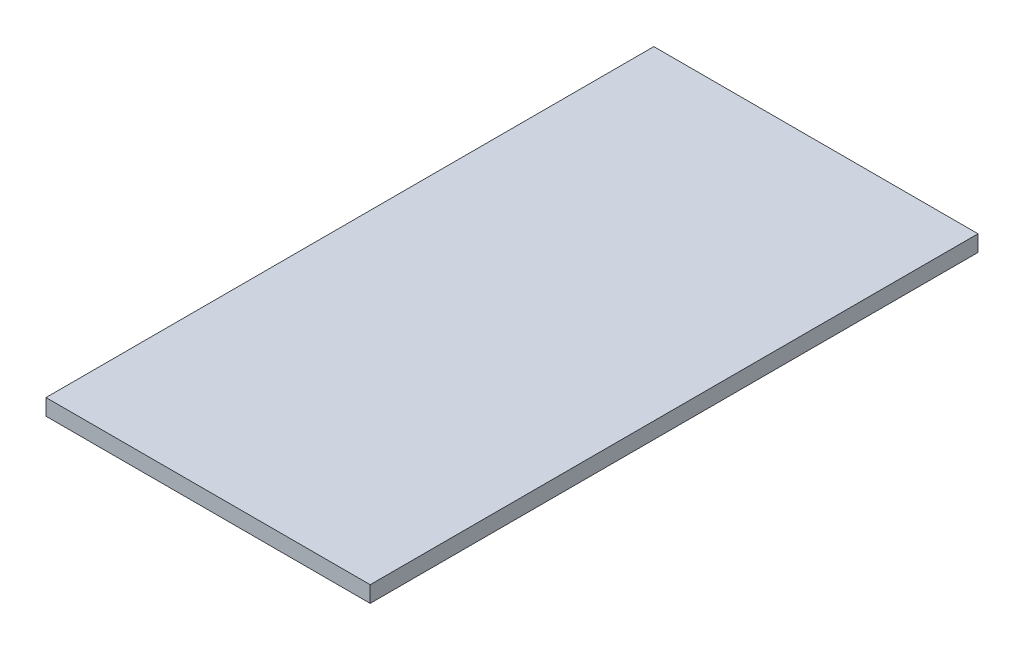
ISO-10303-21;
HEADER;
FILE_DESCRIPTION(('STEP AP214'),'2;1');
FILE_NAME('part.step','',(''),(''),'','','');
FILE_SCHEMA(('AUTOMOTIVE_DESIGN { 1 0 10303 214 1 1 1 1 }'));
ENDSEC;
DATA;
#1=APPLICATION_CONTEXT('core data for automotive mechanical design processes');
#2=APPLICATION_PROTOCOL_DEFINITION('international standard','automotive_design',2000,#1);
#3=PRODUCT_CONTEXT('',#1,'mechanical');
#4=PRODUCT('Part','Part','',(#3));
#5=PRODUCT_RELATED_PRODUCT_CATEGORY('part','',(#4));
#6=PRODUCT_DEFINITION_FORMATION('','',#4);
#7=PRODUCT_DEFINITION_CONTEXT('part definition',#1,'design');
#8=PRODUCT_DEFINITION('design','',#6,#7);
#9=PRODUCT_DEFINITION_SHAPE('','',#8);
#10=(LENGTH_UNIT() NAMED_UNIT(*) SI_UNIT(.MILLI.,.METRE.));
#11=(NAMED_UNIT(*) PLANE_ANGLE_UNIT() SI_UNIT($,.RADIAN.));
#12=(NAMED_UNIT(*) SI_UNIT($,.STERADIAN.) SOLID_ANGLE_UNIT());
#13=UNCERTAINTY_MEASURE_WITH_UNIT(LENGTH_MEASURE(1.E-05),#10,'distance_accuracy_value','');
#14=(GEOMETRIC_REPRESENTATION_CONTEXT(3) GLOBAL_UNCERTAINTY_ASSIGNED_CONTEXT((#13)) GLOBAL_UNIT_ASSIGNED_CONTEXT((#10,
#11,#12)) REPRESENTATION_CONTEXT('',''));
#15=CARTESIAN_POINT('',(0.,0.,0.));
#16=DIRECTION('',(0.,0.,1.));
#17=DIRECTION('',(1.,0.,0.));
#18=AXIS2_PLACEMENT_3D('',#15,#16,#17);
#19=CARTESIAN_POINT('',(40.,4.,-75.));
#20=DIRECTION('',(-1.,0.,0.));
#21=DIRECTION('',(0.,0.,1.));
#22=AXIS2_PLACEMENT_3D('',#19,#20,#21);
#23=PLANE('',#22);
#24=DIRECTION('',(0.,0.,-1.));
#25=VECTOR('',#24,1.);
#26=CARTESIAN_POINT('',(40.,0.,-75.));
#27=LINE('',#26,#25);
#28=CARTESIAN_POINT('',(40.,0.,75.));
#29=VERTEX_POINT('',#28);
#30=CARTESIAN_POINT('',(40.,0.,-75.));
#31=VERTEX_POINT('',#30);
#32=EDGE_CURVE('E102',#29,#31,#27,.T.);
#33=ORIENTED_EDGE('',*,*,#32,.T.);
#34=DIRECTION('',(0.,-1.,0.));
#35=VECTOR('',#34,1.);
#36=CARTESIAN_POINT('',(40.,4.,-75.));
#37=LINE('',#36,#35);
#38=CARTESIAN_POINT('',(40.,4.,-75.));
#39=VERTEX_POINT('',#38);
#40=EDGE_CURVE('E11',#39,#31,#37,.T.);
#41=ORIENTED_EDGE('',*,*,#40,.F.);
#42=DIRECTION('',(0.,0.,-1.));
#43=VECTOR('',#42,1.);
#44=CARTESIAN_POINT('',(40.,4.,-75.));
#45=LINE('',#44,#43);
#46=CARTESIAN_POINT('',(40.,4.,75.));
#47=VERTEX_POINT('',#46);
#48=EDGE_CURVE('E90',#47,#39,#45,.T.);
#49=ORIENTED_EDGE('',*,*,#48,.F.);
#50=DIRECTION('',(0.,-1.,0.));
#51=VECTOR('',#50,1.);
#52=CARTESIAN_POINT('',(40.,4.,75.));
#53=LINE('',#52,#51);
#54=EDGE_CURVE('E98',#47,#29,#53,.T.);
#55=ORIENTED_EDGE('',*,*,#54,.T.);
#56=EDGE_LOOP('',(#33,#41,#49,#55));
#57=FACE_BOUND('',#56,.T.);
#58=ADVANCED_FACE('F39',(#57),#23,.F.);
#59=CARTESIAN_POINT('',(-40.,4.,-75.));
#60=DIRECTION('',(0.,0.,1.));
#61=DIRECTION('',(1.,0.,0.));
#62=AXIS2_PLACEMENT_3D('',#59,#60,#61);
#63=PLANE('',#62);
#64=DIRECTION('',(-1.,0.,0.));
#65=VECTOR('',#64,1.);
#66=CARTESIAN_POINT('',(-40.,0.,-75.));
#67=LINE('',#66,#65);
#68=CARTESIAN_POINT('',(-40.,0.,-75.));
#69=VERTEX_POINT('',#68);
#70=EDGE_CURVE('E94',#31,#69,#67,.T.);
#71=ORIENTED_EDGE('',*,*,#70,.T.);
#72=DIRECTION('',(0.,-1.,0.));
#73=VECTOR('',#72,1.);
#74=CARTESIAN_POINT('',(-40.,4.,-75.));
#75=LINE('',#74,#73);
#76=CARTESIAN_POINT('',(-40.,4.,-75.));
#77=VERTEX_POINT('',#76);
#78=EDGE_CURVE('E47',#77,#69,#75,.T.);
#79=ORIENTED_EDGE('',*,*,#78,.F.);
#80=DIRECTION('',(-1.,0.,0.));
#81=VECTOR('',#80,1.);
#82=CARTESIAN_POINT('',(-40.,4.,-75.));
#83=LINE('',#82,#81);
#84=EDGE_CURVE('E85',#39,#77,#83,.T.);
#85=ORIENTED_EDGE('',*,*,#84,.F.);
#86=ORIENTED_EDGE('',*,*,#40,.T.);
#87=EDGE_LOOP('',(#71,#79,#85,#86));
#88=FACE_BOUND('',#87,.T.);
#89=ADVANCED_FACE('F93',(#88),#63,.F.);
#90=CARTESIAN_POINT('',(-40.,4.,-75.));
#91=DIRECTION('',(1.,0.,0.));
#92=DIRECTION('',(0.,0.,-1.));
#93=AXIS2_PLACEMENT_3D('',#90,#91,#92);
#94=PLANE('',#93);
#95=DIRECTION('',(0.,0.,1.));
#96=VECTOR('',#95,1.);
#97=CARTESIAN_POINT('',(-40.,0.,-75.));
#98=LINE('',#97,#96);
#99=CARTESIAN_POINT('',(-40.,0.,75.));
#100=VERTEX_POINT('',#99);
#101=EDGE_CURVE('E72',#69,#100,#98,.T.);
#102=ORIENTED_EDGE('',*,*,#101,.T.);
#103=DIRECTION('',(0.,-1.,0.));
#104=VECTOR('',#103,1.);
#105=CARTESIAN_POINT('',(-40.,4.,75.));
#106=LINE('',#105,#104);
#107=CARTESIAN_POINT('',(-40.,4.,75.));
#108=VERTEX_POINT('',#107);
#109=EDGE_CURVE('E95',#108,#100,#106,.T.);
#110=ORIENTED_EDGE('',*,*,#109,.F.);
#111=DIRECTION('',(0.,0.,1.));
#112=VECTOR('',#111,1.);
#113=CARTESIAN_POINT('',(-40.,4.,-75.));
#114=LINE('',#113,#112);
#115=EDGE_CURVE('E88',#77,#108,#114,.T.);
#116=ORIENTED_EDGE('',*,*,#115,.F.);
#117=ORIENTED_EDGE('',*,*,#78,.T.);
#118=EDGE_LOOP('',(#102,#110,#116,#117));
#119=FACE_BOUND('',#118,.T.);
#120=ADVANCED_FACE('F96',(#119),#94,.F.);
#121=CARTESIAN_POINT('',(-40.,4.,75.));
#122=DIRECTION('',(0.,0.,-1.));
#123=DIRECTION('',(-1.,0.,0.));
#124=AXIS2_PLACEMENT_3D('',#121,#122,#123);
#125=PLANE('',#124);
#126=DIRECTION('',(1.,0.,0.));
#127=VECTOR('',#126,1.);
#128=CARTESIAN_POINT('',(-40.,0.,75.));
#129=LINE('',#128,#127);
#130=EDGE_CURVE('E78',#100,#29,#129,.T.);
#131=ORIENTED_EDGE('',*,*,#130,.T.);
#132=ORIENTED_EDGE('',*,*,#54,.F.);
#133=DIRECTION('',(1.,0.,0.));
#134=VECTOR('',#133,1.);
#135=CARTESIAN_POINT('',(-40.,4.,75.));
#136=LINE('',#135,#134);
#137=EDGE_CURVE('E55',#108,#47,#136,.T.);
#138=ORIENTED_EDGE('',*,*,#137,.F.);
#139=ORIENTED_EDGE('',*,*,#109,.T.);
#140=EDGE_LOOP('',(#131,#132,#138,#139));
#141=FACE_BOUND('',#140,.T.);
#142=ADVANCED_FACE('F109',(#141),#125,.F.);
#143=CARTESIAN_POINT('',(0.,4.,0.));
#144=DIRECTION('',(0.,1.,0.));
#145=DIRECTION('',(0.,0.,1.));
#146=AXIS2_PLACEMENT_3D('',#143,#144,#145);
#147=PLANE('',#146);
#148=ORIENTED_EDGE('',*,*,#48,.T.);
#149=ORIENTED_EDGE('',*,*,#84,.T.);
#150=ORIENTED_EDGE('',*,*,#115,.T.);
#151=ORIENTED_EDGE('',*,*,#137,.T.);
#152=EDGE_LOOP('',(#148,#149,#150,#151));
#153=FACE_BOUND('',#152,.T.);
#154=ADVANCED_FACE('F86',(#153),#147,.T.);
#155=CARTESIAN_POINT('',(0.,0.,0.));
#156=DIRECTION('',(0.,1.,0.));
#157=DIRECTION('',(0.,0.,1.));
#158=AXIS2_PLACEMENT_3D('',#155,#156,#157);
#159=PLANE('',#158);
#160=ORIENTED_EDGE('',*,*,#32,.F.);
#161=ORIENTED_EDGE('',*,*,#130,.F.);
#162=ORIENTED_EDGE('',*,*,#101,.F.);
#163=ORIENTED_EDGE('',*,*,#70,.F.);
#164=EDGE_LOOP('',(#160,#161,#162,#163));
#165=FACE_BOUND('',#164,.T.);
#166=ADVANCED_FACE('F112',(#165),#159,.F.);
#167=CLOSED_SHELL('',(#58,#89,#120,#142,#154,#166));
#168=MANIFOLD_SOLID_BREP('B2',#167);
#169=ADVANCED_BREP_SHAPE_REPRESENTATION('',(#18,#168),#14);
#170=SHAPE_DEFINITION_REPRESENTATION(#9,#169);
ENDSEC;
END-ISO-10303-21;
